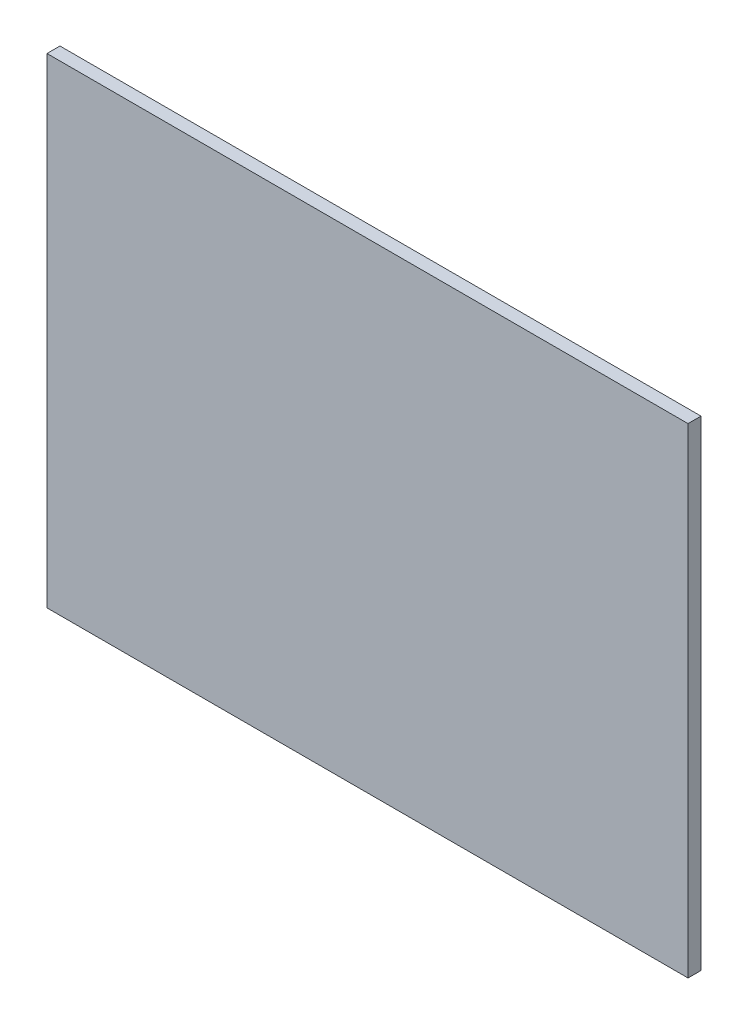
ISO-10303-21;
HEADER;
FILE_DESCRIPTION(('STEP AP214'),'2;1');
FILE_NAME('part.step','',(''),(''),'','','');
FILE_SCHEMA(('AUTOMOTIVE_DESIGN { 1 0 10303 214 1 1 1 1 }'));
ENDSEC;
DATA;
#1=APPLICATION_CONTEXT('core data for automotive mechanical design processes');
#2=APPLICATION_PROTOCOL_DEFINITION('international standard','automotive_design',2000,#1);
#3=PRODUCT_CONTEXT('',#1,'mechanical');
#4=PRODUCT('Part','Part','',(#3));
#5=PRODUCT_RELATED_PRODUCT_CATEGORY('part','',(#4));
#6=PRODUCT_DEFINITION_FORMATION('','',#4);
#7=PRODUCT_DEFINITION_CONTEXT('part definition',#1,'design');
#8=PRODUCT_DEFINITION('design','',#6,#7);
#9=PRODUCT_DEFINITION_SHAPE('','',#8);
#10=(LENGTH_UNIT() NAMED_UNIT(*) SI_UNIT(.MILLI.,.METRE.));
#11=(NAMED_UNIT(*) PLANE_ANGLE_UNIT() SI_UNIT($,.RADIAN.));
#12=(NAMED_UNIT(*) SI_UNIT($,.STERADIAN.) SOLID_ANGLE_UNIT());
#13=UNCERTAINTY_MEASURE_WITH_UNIT(LENGTH_MEASURE(1.E-05),#10,'distance_accuracy_value','');
#14=(GEOMETRIC_REPRESENTATION_CONTEXT(3) GLOBAL_UNCERTAINTY_ASSIGNED_CONTEXT((#13)) GLOBAL_UNIT_ASSIGNED_CONTEXT((#10,
#11,#12)) REPRESENTATION_CONTEXT('',''));
#15=CARTESIAN_POINT('',(0.,0.,0.));
#16=DIRECTION('',(0.,0.,1.));
#17=DIRECTION('',(1.,0.,0.));
#18=AXIS2_PLACEMENT_3D('',#15,#16,#17);
#19=CARTESIAN_POINT('',(123.5,-185.,-5.));
#20=DIRECTION('',(1.,0.,0.));
#21=DIRECTION('',(0.,0.,-1.));
#22=AXIS2_PLACEMENT_3D('',#19,#20,#21);
#23=PLANE('',#22);
#24=DIRECTION('',(0.,1.,0.));
#25=VECTOR('',#24,1.);
#26=CARTESIAN_POINT('',(123.5,-185.,0.));
#27=LINE('',#26,#25);
#28=CARTESIAN_POINT('',(123.5,-185.,0.));
#29=VERTEX_POINT('',#28);
#30=CARTESIAN_POINT('',(123.5,0.,0.));
#31=VERTEX_POINT('',#30);
#32=EDGE_CURVE('E97',#29,#31,#27,.T.);
#33=ORIENTED_EDGE('',*,*,#32,.F.);
#34=DIRECTION('',(0.,0.,1.));
#35=VECTOR('',#34,1.);
#36=CARTESIAN_POINT('',(123.5,-185.,-5.));
#37=LINE('',#36,#35);
#38=CARTESIAN_POINT('',(123.5,-185.,-5.));
#39=VERTEX_POINT('',#38);
#40=EDGE_CURVE('E11',#39,#29,#37,.T.);
#41=ORIENTED_EDGE('',*,*,#40,.F.);
#42=DIRECTION('',(0.,1.,0.));
#43=VECTOR('',#42,1.);
#44=CARTESIAN_POINT('',(123.5,-185.,-5.));
#45=LINE('',#44,#43);
#46=CARTESIAN_POINT('',(123.5,0.,-5.));
#47=VERTEX_POINT('',#46);
#48=EDGE_CURVE('E91',#39,#47,#45,.T.);
#49=ORIENTED_EDGE('',*,*,#48,.T.);
#50=DIRECTION('',(0.,0.,1.));
#51=VECTOR('',#50,1.);
#52=CARTESIAN_POINT('',(123.5,0.,-5.));
#53=LINE('',#52,#51);
#54=EDGE_CURVE('E36',#47,#31,#53,.T.);
#55=ORIENTED_EDGE('',*,*,#54,.T.);
#56=EDGE_LOOP('',(#33,#41,#49,#55));
#57=FACE_BOUND('',#56,.T.);
#58=ADVANCED_FACE('F33',(#57),#23,.T.);
#59=CARTESIAN_POINT('',(-123.5,-185.,-5.));
#60=DIRECTION('',(0.,-1.,0.));
#61=DIRECTION('',(0.,0.,-1.));
#62=AXIS2_PLACEMENT_3D('',#59,#60,#61);
#63=PLANE('',#62);
#64=DIRECTION('',(1.,0.,0.));
#65=VECTOR('',#64,1.);
#66=CARTESIAN_POINT('',(-123.5,-185.,0.));
#67=LINE('',#66,#65);
#68=CARTESIAN_POINT('',(-123.5,-185.,0.));
#69=VERTEX_POINT('',#68);
#70=EDGE_CURVE('E93',#69,#29,#67,.T.);
#71=ORIENTED_EDGE('',*,*,#70,.F.);
#72=DIRECTION('',(0.,0.,1.));
#73=VECTOR('',#72,1.);
#74=CARTESIAN_POINT('',(-123.5,-185.,-5.));
#75=LINE('',#74,#73);
#76=CARTESIAN_POINT('',(-123.5,-185.,-5.));
#77=VERTEX_POINT('',#76);
#78=EDGE_CURVE('E42',#77,#69,#75,.T.);
#79=ORIENTED_EDGE('',*,*,#78,.F.);
#80=DIRECTION('',(1.,0.,0.));
#81=VECTOR('',#80,1.);
#82=CARTESIAN_POINT('',(-123.5,-185.,-5.));
#83=LINE('',#82,#81);
#84=EDGE_CURVE('E88',#77,#39,#83,.T.);
#85=ORIENTED_EDGE('',*,*,#84,.T.);
#86=ORIENTED_EDGE('',*,*,#40,.T.);
#87=EDGE_LOOP('',(#71,#79,#85,#86));
#88=FACE_BOUND('',#87,.T.);
#89=ADVANCED_FACE('F107',(#88),#63,.T.);
#90=CARTESIAN_POINT('',(-123.5,0.,-5.));
#91=DIRECTION('',(-1.,0.,0.));
#92=DIRECTION('',(0.,-1.,0.));
#93=AXIS2_PLACEMENT_3D('',#90,#91,#92);
#94=PLANE('',#93);
#95=DIRECTION('',(0.,-1.,0.));
#96=VECTOR('',#95,1.);
#97=CARTESIAN_POINT('',(-123.5,0.,0.));
#98=LINE('',#97,#96);
#99=CARTESIAN_POINT('',(-123.5,0.,0.));
#100=VERTEX_POINT('',#99);
#101=EDGE_CURVE('E83',#100,#69,#98,.T.);
#102=ORIENTED_EDGE('',*,*,#101,.F.);
#103=DIRECTION('',(0.,0.,1.));
#104=VECTOR('',#103,1.);
#105=CARTESIAN_POINT('',(-123.5,0.,-5.));
#106=LINE('',#105,#104);
#107=CARTESIAN_POINT('',(-123.5,0.,-5.));
#108=VERTEX_POINT('',#107);
#109=EDGE_CURVE('E78',#108,#100,#106,.T.);
#110=ORIENTED_EDGE('',*,*,#109,.F.);
#111=DIRECTION('',(0.,-1.,0.));
#112=VECTOR('',#111,1.);
#113=CARTESIAN_POINT('',(-123.5,0.,-5.));
#114=LINE('',#113,#112);
#115=EDGE_CURVE('E81',#108,#77,#114,.T.);
#116=ORIENTED_EDGE('',*,*,#115,.T.);
#117=ORIENTED_EDGE('',*,*,#78,.T.);
#118=EDGE_LOOP('',(#102,#110,#116,#117));
#119=FACE_BOUND('',#118,.T.);
#120=ADVANCED_FACE('F80',(#119),#94,.T.);
#121=CARTESIAN_POINT('',(123.5,0.,-5.));
#122=DIRECTION('',(0.,1.,0.));
#123=DIRECTION('',(-1.,0.,0.));
#124=AXIS2_PLACEMENT_3D('',#121,#122,#123);
#125=PLANE('',#124);
#126=DIRECTION('',(-1.,0.,0.));
#127=VECTOR('',#126,1.);
#128=CARTESIAN_POINT('',(123.5,0.,0.));
#129=LINE('',#128,#127);
#130=EDGE_CURVE('E100',#31,#100,#129,.T.);
#131=ORIENTED_EDGE('',*,*,#130,.F.);
#132=ORIENTED_EDGE('',*,*,#54,.F.);
#133=DIRECTION('',(-1.,0.,0.));
#134=VECTOR('',#133,1.);
#135=CARTESIAN_POINT('',(123.5,0.,-5.));
#136=LINE('',#135,#134);
#137=EDGE_CURVE('E87',#47,#108,#136,.T.);
#138=ORIENTED_EDGE('',*,*,#137,.T.);
#139=ORIENTED_EDGE('',*,*,#109,.T.);
#140=EDGE_LOOP('',(#131,#132,#138,#139));
#141=FACE_BOUND('',#140,.T.);
#142=ADVANCED_FACE('F90',(#141),#125,.T.);
#143=CARTESIAN_POINT('',(0.,0.,-5.));
#144=DIRECTION('',(0.,0.,1.));
#145=DIRECTION('',(1.,0.,0.));
#146=AXIS2_PLACEMENT_3D('',#143,#144,#145);
#147=PLANE('',#146);
#148=ORIENTED_EDGE('',*,*,#48,.F.);
#149=ORIENTED_EDGE('',*,*,#84,.F.);
#150=ORIENTED_EDGE('',*,*,#115,.F.);
#151=ORIENTED_EDGE('',*,*,#137,.F.);
#152=EDGE_LOOP('',(#148,#149,#150,#151));
#153=FACE_BOUND('',#152,.T.);
#154=ADVANCED_FACE('F86',(#153),#147,.F.);
#155=CARTESIAN_POINT('',(0.,0.,0.));
#156=DIRECTION('',(0.,0.,1.));
#157=DIRECTION('',(1.,0.,0.));
#158=AXIS2_PLACEMENT_3D('',#155,#156,#157);
#159=PLANE('',#158);
#160=ORIENTED_EDGE('',*,*,#32,.T.);
#161=ORIENTED_EDGE('',*,*,#130,.T.);
#162=ORIENTED_EDGE('',*,*,#101,.T.);
#163=ORIENTED_EDGE('',*,*,#70,.T.);
#164=EDGE_LOOP('',(#160,#161,#162,#163));
#165=FACE_BOUND('',#164,.T.);
#166=ADVANCED_FACE('F106',(#165),#159,.T.);
#167=CLOSED_SHELL('',(#58,#89,#120,#142,#154,#166));
#168=MANIFOLD_SOLID_BREP('B2',#167);
#169=ADVANCED_BREP_SHAPE_REPRESENTATION('',(#18,#168),#14);
#170=SHAPE_DEFINITION_REPRESENTATION(#9,#169);
ENDSEC;
END-ISO-10303-21;
